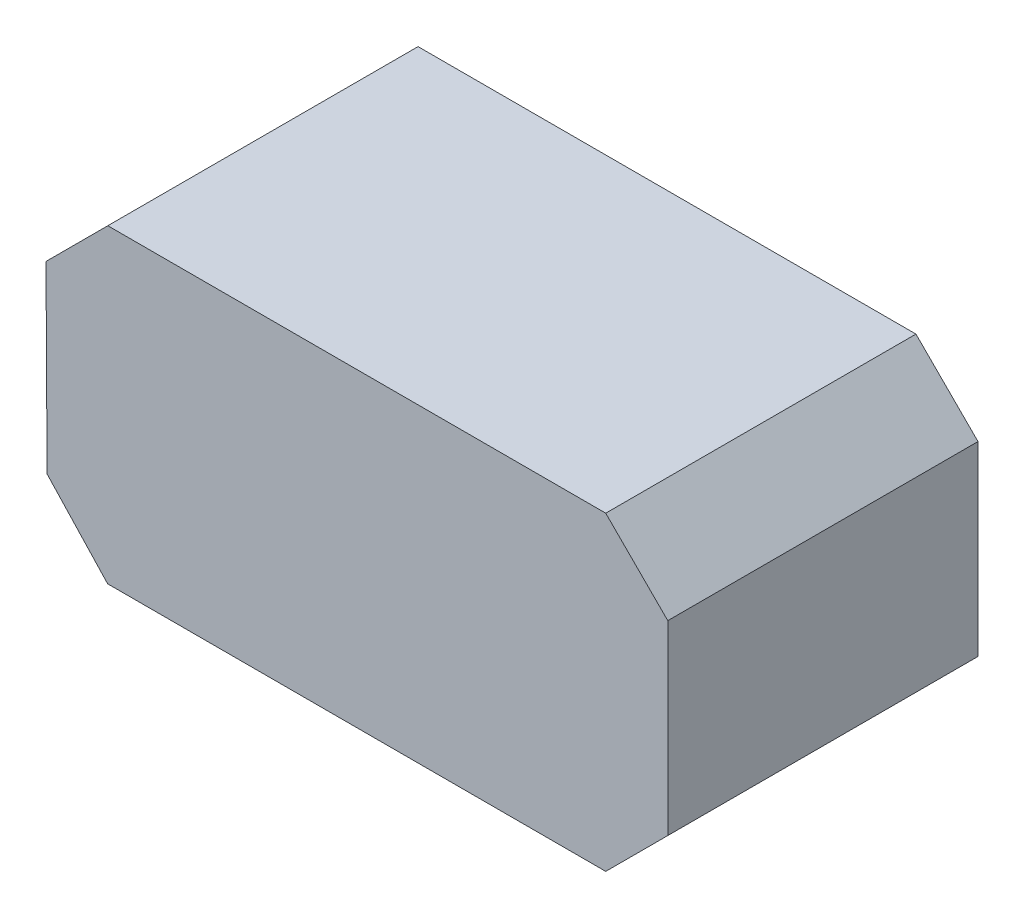
ISO-10303-21;
HEADER;
FILE_DESCRIPTION(('STEP AP214'),'2;1');
FILE_NAME('part.step','',(''),(''),'','','');
FILE_SCHEMA(('AUTOMOTIVE_DESIGN { 1 0 10303 214 1 1 1 1 }'));
ENDSEC;
DATA;
#1=APPLICATION_CONTEXT('core data for automotive mechanical design processes');
#2=APPLICATION_PROTOCOL_DEFINITION('international standard','automotive_design',2000,#1);
#3=PRODUCT_CONTEXT('',#1,'mechanical');
#4=PRODUCT('Part','Part','',(#3));
#5=PRODUCT_RELATED_PRODUCT_CATEGORY('part','',(#4));
#6=PRODUCT_DEFINITION_FORMATION('','',#4);
#7=PRODUCT_DEFINITION_CONTEXT('part definition',#1,'design');
#8=PRODUCT_DEFINITION('design','',#6,#7);
#9=PRODUCT_DEFINITION_SHAPE('','',#8);
#10=(LENGTH_UNIT() NAMED_UNIT(*) SI_UNIT(.MILLI.,.METRE.));
#11=(NAMED_UNIT(*) PLANE_ANGLE_UNIT() SI_UNIT($,.RADIAN.));
#12=(NAMED_UNIT(*) SI_UNIT($,.STERADIAN.) SOLID_ANGLE_UNIT());
#13=UNCERTAINTY_MEASURE_WITH_UNIT(LENGTH_MEASURE(1.E-05),#10,'distance_accuracy_value','');
#14=(GEOMETRIC_REPRESENTATION_CONTEXT(3) GLOBAL_UNCERTAINTY_ASSIGNED_CONTEXT((#13)) GLOBAL_UNIT_ASSIGNED_CONTEXT((#10,
#11,#12)) REPRESENTATION_CONTEXT('',''));
#15=CARTESIAN_POINT('',(0.,0.,0.));
#16=DIRECTION('',(0.,0.,1.));
#17=DIRECTION('',(1.,0.,0.));
#18=AXIS2_PLACEMENT_3D('',#15,#16,#17);
#19=CARTESIAN_POINT('',(-2.54542036,0.76385674,0.));
#20=DIRECTION('',(0.999982703621133,0.00588153539224678,0.));
#21=DIRECTION('',(-0.00588153539224678,0.999982703621133,0.));
#22=AXIS2_PLACEMENT_3D('',#19,#20,#21);
#23=PLANE('',#22);
#24=DIRECTION('',(0.,0.,1.));
#25=VECTOR('',#24,1.);
#26=CARTESIAN_POINT('',(-2.53658116,-0.73899014,0.));
#27=LINE('',#26,#25);
#28=CARTESIAN_POINT('',(-2.53658116,-0.73899014,0.));
#29=VERTEX_POINT('',#28);
#30=CARTESIAN_POINT('',(-2.53658116,-0.73899014,2.54));
#31=VERTEX_POINT('',#30);
#32=EDGE_CURVE('E118',#29,#31,#27,.T.);
#33=ORIENTED_EDGE('',*,*,#32,.T.);
#34=DIRECTION('',(-0.00588153539224678,0.999982703621133,0.));
#35=VECTOR('',#34,1.);
#36=CARTESIAN_POINT('',(-2.54542036,0.76385674,2.54));
#37=LINE('',#36,#35);
#38=CARTESIAN_POINT('',(-2.54542036,0.76385674,2.54));
#39=VERTEX_POINT('',#38);
#40=EDGE_CURVE('E20',#39,#31,#37,.F.);
#41=ORIENTED_EDGE('',*,*,#40,.F.);
#42=DIRECTION('',(0.,0.,1.));
#43=VECTOR('',#42,1.);
#44=CARTESIAN_POINT('',(-2.54542036,0.76385674,0.));
#45=LINE('',#44,#43);
#46=CARTESIAN_POINT('',(-2.54542036,0.76385674,0.));
#47=VERTEX_POINT('',#46);
#48=EDGE_CURVE('E98',#39,#47,#45,.F.);
#49=ORIENTED_EDGE('',*,*,#48,.T.);
#50=DIRECTION('',(-0.00588153539224678,0.999982703621133,0.));
#51=VECTOR('',#50,1.);
#52=CARTESIAN_POINT('',(-2.54542036,0.76385674,0.));
#53=LINE('',#52,#51);
#54=EDGE_CURVE('E77',#29,#47,#53,.T.);
#55=ORIENTED_EDGE('',*,*,#54,.F.);
#56=EDGE_LOOP('',(#33,#41,#49,#55));
#57=FACE_BOUND('',#56,.T.);
#58=ADVANCED_FACE('F17',(#57),#23,.F.);
#59=CARTESIAN_POINT('',(2.5454229,-0.762,0.));
#60=DIRECTION('',(-1.,0.,0.));
#61=DIRECTION('',(0.,0.,1.));
#62=AXIS2_PLACEMENT_3D('',#59,#60,#61);
#63=PLANE('',#62);
#64=DIRECTION('',(0.,0.,1.));
#65=VECTOR('',#64,1.);
#66=CARTESIAN_POINT('',(2.5454229,0.762,0.));
#67=LINE('',#66,#65);
#68=CARTESIAN_POINT('',(2.5454229,0.762,0.));
#69=VERTEX_POINT('',#68);
#70=CARTESIAN_POINT('',(2.5454229,0.762,2.54));
#71=VERTEX_POINT('',#70);
#72=EDGE_CURVE('E86',#69,#71,#67,.T.);
#73=ORIENTED_EDGE('',*,*,#72,.T.);
#74=DIRECTION('',(0.,1.,0.));
#75=VECTOR('',#74,1.);
#76=CARTESIAN_POINT('',(2.5454229,1.27,2.54));
#77=LINE('',#76,#75);
#78=CARTESIAN_POINT('',(2.5454229,-0.761999999999999,2.54));
#79=VERTEX_POINT('',#78);
#80=EDGE_CURVE('E123',#71,#79,#77,.F.);
#81=ORIENTED_EDGE('',*,*,#80,.T.);
#82=DIRECTION('',(0.,0.,1.));
#83=VECTOR('',#82,1.);
#84=CARTESIAN_POINT('',(2.5454229,-0.762,0.));
#85=LINE('',#84,#83);
#86=CARTESIAN_POINT('',(2.5454229,-0.762,0.));
#87=VERTEX_POINT('',#86);
#88=EDGE_CURVE('E89',#79,#87,#85,.F.);
#89=ORIENTED_EDGE('',*,*,#88,.T.);
#90=DIRECTION('',(0.,1.,0.));
#91=VECTOR('',#90,1.);
#92=CARTESIAN_POINT('',(2.5454229,-0.762,0.));
#93=LINE('',#92,#91);
#94=EDGE_CURVE('E82',#69,#87,#93,.F.);
#95=ORIENTED_EDGE('',*,*,#94,.F.);
#96=EDGE_LOOP('',(#73,#81,#89,#95));
#97=FACE_BOUND('',#96,.T.);
#98=ADVANCED_FACE('F84',(#97),#63,.F.);
#99=CARTESIAN_POINT('',(2.5454229,0.762,0.));
#100=DIRECTION('',(-0.707106781186548,-0.707106781186548,0.));
#101=DIRECTION('',(0.707106781186548,-0.707106781186548,0.));
#102=AXIS2_PLACEMENT_3D('',#99,#100,#101);
#103=PLANE('',#102);
#104=DIRECTION('',(0.,0.,-1.));
#105=VECTOR('',#104,1.);
#106=CARTESIAN_POINT('',(2.0374229,1.27,0.));
#107=LINE('',#106,#105);
#108=CARTESIAN_POINT('',(2.0374229,1.27,0.));
#109=VERTEX_POINT('',#108);
#110=CARTESIAN_POINT('',(2.0374229,1.27,2.54));
#111=VERTEX_POINT('',#110);
#112=EDGE_CURVE('E143',#109,#111,#107,.F.);
#113=ORIENTED_EDGE('',*,*,#112,.T.);
#114=DIRECTION('',(0.707106781186548,-0.707106781186547,0.));
#115=VECTOR('',#114,1.);
#116=CARTESIAN_POINT('',(2.0374229,1.27,2.54));
#117=LINE('',#116,#115);
#118=EDGE_CURVE('E102',#111,#71,#117,.T.);
#119=ORIENTED_EDGE('',*,*,#118,.T.);
#120=ORIENTED_EDGE('',*,*,#72,.F.);
#121=DIRECTION('',(0.707106781186548,-0.707106781186548,0.));
#122=VECTOR('',#121,1.);
#123=CARTESIAN_POINT('',(2.5454229,0.762,0.));
#124=LINE('',#123,#122);
#125=EDGE_CURVE('E93',#109,#69,#124,.T.);
#126=ORIENTED_EDGE('',*,*,#125,.F.);
#127=EDGE_LOOP('',(#113,#119,#120,#126));
#128=FACE_BOUND('',#127,.T.);
#129=ADVANCED_FACE('F100',(#128),#103,.F.);
#130=CARTESIAN_POINT('',(-2.0392771,1.27,0.));
#131=DIRECTION('',(0.707106781186548,-0.707106781186548,0.));
#132=DIRECTION('',(0.707106781186548,0.707106781186548,0.));
#133=AXIS2_PLACEMENT_3D('',#130,#131,#132);
#134=PLANE('',#133);
#135=ORIENTED_EDGE('',*,*,#48,.F.);
#136=DIRECTION('',(0.707106781186547,0.707106781186548,0.));
#137=VECTOR('',#136,1.);
#138=CARTESIAN_POINT('',(-2.54542036,0.76385674,2.54));
#139=LINE('',#138,#137);
#140=CARTESIAN_POINT('',(-2.0392771,1.27,2.54));
#141=VERTEX_POINT('',#140);
#142=EDGE_CURVE('E115',#39,#141,#139,.T.);
#143=ORIENTED_EDGE('',*,*,#142,.T.);
#144=DIRECTION('',(0.,0.,-1.));
#145=VECTOR('',#144,1.);
#146=CARTESIAN_POINT('',(-2.0392771,1.27,0.));
#147=LINE('',#146,#145);
#148=CARTESIAN_POINT('',(-2.0392771,1.27,0.));
#149=VERTEX_POINT('',#148);
#150=EDGE_CURVE('E137',#141,#149,#147,.T.);
#151=ORIENTED_EDGE('',*,*,#150,.T.);
#152=DIRECTION('',(0.707106781186548,0.707106781186548,0.));
#153=VECTOR('',#152,1.);
#154=CARTESIAN_POINT('',(-2.0392771,1.27,0.));
#155=LINE('',#154,#153);
#156=EDGE_CURVE('E119',#47,#149,#155,.T.);
#157=ORIENTED_EDGE('',*,*,#156,.F.);
#158=EDGE_LOOP('',(#135,#143,#151,#157));
#159=FACE_BOUND('',#158,.T.);
#160=ADVANCED_FACE('F135',(#159),#134,.F.);
#161=CARTESIAN_POINT('',(-2.53658116,-0.73899014,0.));
#162=DIRECTION('',(0.731054803099051,0.682318748728047,0.));
#163=DIRECTION('',(-0.682318748728047,0.731054803099051,0.));
#164=AXIS2_PLACEMENT_3D('',#161,#162,#163);
#165=PLANE('',#164);
#166=DIRECTION('',(0.,0.,1.));
#167=VECTOR('',#166,1.);
#168=CARTESIAN_POINT('',(-2.04097128,-1.27,0.));
#169=LINE('',#168,#167);
#170=CARTESIAN_POINT('',(-2.04097127999996,-1.26999999999996,0.));
#171=VERTEX_POINT('',#170);
#172=CARTESIAN_POINT('',(-2.04097127999996,-1.26999999999996,2.54));
#173=VERTEX_POINT('',#172);
#174=EDGE_CURVE('E122',#171,#173,#169,.T.);
#175=ORIENTED_EDGE('',*,*,#174,.T.);
#176=DIRECTION('',(-0.682318748727935,0.731054803099156,0.));
#177=VECTOR('',#176,1.);
#178=CARTESIAN_POINT('',(-2.04097128,-1.27,2.54));
#179=LINE('',#178,#177);
#180=EDGE_CURVE('E112',#173,#31,#179,.T.);
#181=ORIENTED_EDGE('',*,*,#180,.T.);
#182=ORIENTED_EDGE('',*,*,#32,.F.);
#183=DIRECTION('',(-0.682318748728047,0.731054803099051,0.));
#184=VECTOR('',#183,1.);
#185=CARTESIAN_POINT('',(-2.53658116,-0.73899014,0.));
#186=LINE('',#185,#184);
#187=EDGE_CURVE('E35',#171,#29,#186,.T.);
#188=ORIENTED_EDGE('',*,*,#187,.F.);
#189=EDGE_LOOP('',(#175,#181,#182,#188));
#190=FACE_BOUND('',#189,.T.);
#191=ADVANCED_FACE('F121',(#190),#165,.F.);
#192=CARTESIAN_POINT('',(-2.0392771,1.27,2.54));
#193=DIRECTION('',(0.,0.,-1.));
#194=DIRECTION('',(-1.,0.,0.));
#195=AXIS2_PLACEMENT_3D('',#192,#193,#194);
#196=PLANE('',#195);
#197=ORIENTED_EDGE('',*,*,#40,.T.);
#198=ORIENTED_EDGE('',*,*,#180,.F.);
#199=DIRECTION('',(1.,0.,0.));
#200=VECTOR('',#199,1.);
#201=CARTESIAN_POINT('',(-2.04097128,-1.27,2.54));
#202=LINE('',#201,#200);
#203=CARTESIAN_POINT('',(2.0374229,-1.27,2.54));
#204=VERTEX_POINT('',#203);
#205=EDGE_CURVE('E147',#173,#204,#202,.T.);
#206=ORIENTED_EDGE('',*,*,#205,.T.);
#207=DIRECTION('',(-0.707106781186548,-0.707106781186548,0.));
#208=VECTOR('',#207,1.);
#209=CARTESIAN_POINT('',(2.0374229,-1.27,2.54));
#210=LINE('',#209,#208);
#211=EDGE_CURVE('E125',#204,#79,#210,.F.);
#212=ORIENTED_EDGE('',*,*,#211,.T.);
#213=ORIENTED_EDGE('',*,*,#80,.F.);
#214=ORIENTED_EDGE('',*,*,#118,.F.);
#215=DIRECTION('',(1.,0.,0.));
#216=VECTOR('',#215,1.);
#217=CARTESIAN_POINT('',(2.0374229,1.27,2.54));
#218=LINE('',#217,#216);
#219=EDGE_CURVE('E140',#111,#141,#218,.F.);
#220=ORIENTED_EDGE('',*,*,#219,.T.);
#221=ORIENTED_EDGE('',*,*,#142,.F.);
#222=EDGE_LOOP('',(#197,#198,#206,#212,#213,#214,#220,#221));
#223=FACE_BOUND('',#222,.T.);
#224=ADVANCED_FACE('F110',(#223),#196,.F.);
#225=CARTESIAN_POINT('',(2.0374229,-1.27,0.));
#226=DIRECTION('',(-0.707106781186548,0.707106781186548,0.));
#227=DIRECTION('',(-0.707106781186548,-0.707106781186548,0.));
#228=AXIS2_PLACEMENT_3D('',#225,#226,#227);
#229=PLANE('',#228);
#230=ORIENTED_EDGE('',*,*,#88,.F.);
#231=ORIENTED_EDGE('',*,*,#211,.F.);
#232=DIRECTION('',(0.,0.,1.));
#233=VECTOR('',#232,1.);
#234=CARTESIAN_POINT('',(2.0374229,-1.27,0.));
#235=LINE('',#234,#233);
#236=CARTESIAN_POINT('',(2.0374229,-1.27,0.));
#237=VERTEX_POINT('',#236);
#238=EDGE_CURVE('E144',#204,#237,#235,.F.);
#239=ORIENTED_EDGE('',*,*,#238,.T.);
#240=DIRECTION('',(-0.707106781186548,-0.707106781186548,0.));
#241=VECTOR('',#240,1.);
#242=CARTESIAN_POINT('',(2.0374229,-1.27,0.));
#243=LINE('',#242,#241);
#244=EDGE_CURVE('E154',#87,#237,#243,.T.);
#245=ORIENTED_EDGE('',*,*,#244,.F.);
#246=EDGE_LOOP('',(#230,#231,#239,#245));
#247=FACE_BOUND('',#246,.T.);
#248=ADVANCED_FACE('F160',(#247),#229,.F.);
#249=CARTESIAN_POINT('',(2.0374229,1.27,0.));
#250=DIRECTION('',(0.,-1.,0.));
#251=DIRECTION('',(0.,0.,-1.));
#252=AXIS2_PLACEMENT_3D('',#249,#250,#251);
#253=PLANE('',#252);
#254=ORIENTED_EDGE('',*,*,#150,.F.);
#255=ORIENTED_EDGE('',*,*,#219,.F.);
#256=ORIENTED_EDGE('',*,*,#112,.F.);
#257=DIRECTION('',(-1.,0.,0.));
#258=VECTOR('',#257,1.);
#259=CARTESIAN_POINT('',(-2.0392771,1.27,0.));
#260=LINE('',#259,#258);
#261=EDGE_CURVE('E26',#149,#109,#260,.F.);
#262=ORIENTED_EDGE('',*,*,#261,.F.);
#263=EDGE_LOOP('',(#254,#255,#256,#262));
#264=FACE_BOUND('',#263,.T.);
#265=ADVANCED_FACE('F142',(#264),#253,.F.);
#266=CARTESIAN_POINT('',(-2.04097128,-1.27,0.));
#267=DIRECTION('',(0.,1.,0.));
#268=DIRECTION('',(0.,0.,1.));
#269=AXIS2_PLACEMENT_3D('',#266,#267,#268);
#270=PLANE('',#269);
#271=ORIENTED_EDGE('',*,*,#238,.F.);
#272=ORIENTED_EDGE('',*,*,#205,.F.);
#273=ORIENTED_EDGE('',*,*,#174,.F.);
#274=DIRECTION('',(-1.,0.,0.));
#275=VECTOR('',#274,1.);
#276=CARTESIAN_POINT('',(-2.0392771,-1.27,0.));
#277=LINE('',#276,#275);
#278=EDGE_CURVE('E11',#237,#171,#277,.T.);
#279=ORIENTED_EDGE('',*,*,#278,.F.);
#280=EDGE_LOOP('',(#271,#272,#273,#279));
#281=FACE_BOUND('',#280,.T.);
#282=ADVANCED_FACE('F163',(#281),#270,.F.);
#283=CARTESIAN_POINT('',(-2.0392771,1.27,0.));
#284=DIRECTION('',(0.,0.,-1.));
#285=DIRECTION('',(-1.,0.,0.));
#286=AXIS2_PLACEMENT_3D('',#283,#284,#285);
#287=PLANE('',#286);
#288=ORIENTED_EDGE('',*,*,#54,.T.);
#289=ORIENTED_EDGE('',*,*,#156,.T.);
#290=ORIENTED_EDGE('',*,*,#261,.T.);
#291=ORIENTED_EDGE('',*,*,#125,.T.);
#292=ORIENTED_EDGE('',*,*,#94,.T.);
#293=ORIENTED_EDGE('',*,*,#244,.T.);
#294=ORIENTED_EDGE('',*,*,#278,.T.);
#295=ORIENTED_EDGE('',*,*,#187,.T.);
#296=EDGE_LOOP('',(#288,#289,#290,#291,#292,#293,#294,#295));
#297=FACE_BOUND('',#296,.T.);
#298=ADVANCED_FACE('F94',(#297),#287,.T.);
#299=CLOSED_SHELL('',(#58,#98,#129,#160,#191,#224,#248,#265,#282,#298));
#300=MANIFOLD_SOLID_BREP('B1',#299);
#301=ADVANCED_BREP_SHAPE_REPRESENTATION('',(#18,#300),#14);
#302=SHAPE_DEFINITION_REPRESENTATION(#9,#301);
ENDSEC;
END-ISO-10303-21;
